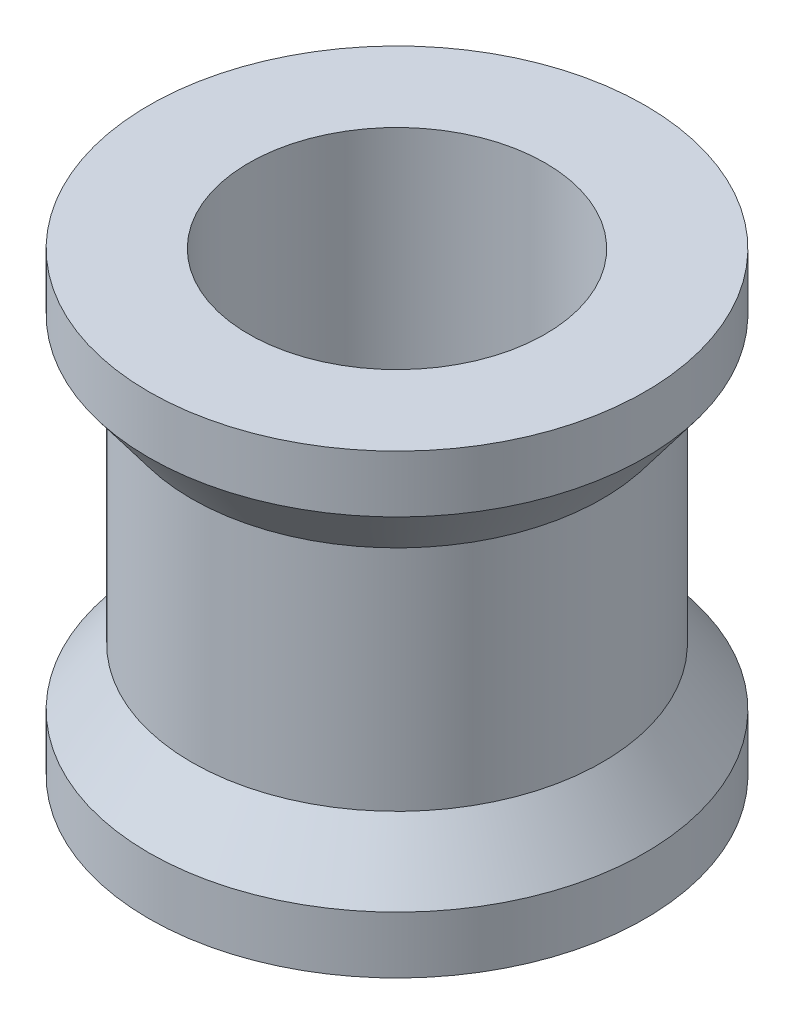
ISO-10303-21;
HEADER;
FILE_DESCRIPTION(('STEP AP214'),'2;1');
FILE_NAME('part.step','',(''),(''),'','','');
FILE_SCHEMA(('AUTOMOTIVE_DESIGN { 1 0 10303 214 1 1 1 1 }'));
ENDSEC;
DATA;
#1=APPLICATION_CONTEXT('core data for automotive mechanical design processes');
#2=APPLICATION_PROTOCOL_DEFINITION('international standard','automotive_design',2000,#1);
#3=PRODUCT_CONTEXT('',#1,'mechanical');
#4=PRODUCT('Part','Part','',(#3));
#5=PRODUCT_RELATED_PRODUCT_CATEGORY('part','',(#4));
#6=PRODUCT_DEFINITION_FORMATION('','',#4);
#7=PRODUCT_DEFINITION_CONTEXT('part definition',#1,'design');
#8=PRODUCT_DEFINITION('design','',#6,#7);
#9=PRODUCT_DEFINITION_SHAPE('','',#8);
#10=(LENGTH_UNIT() NAMED_UNIT(*) SI_UNIT(.MILLI.,.METRE.));
#11=(NAMED_UNIT(*) PLANE_ANGLE_UNIT() SI_UNIT($,.RADIAN.));
#12=(NAMED_UNIT(*) SI_UNIT($,.STERADIAN.) SOLID_ANGLE_UNIT());
#13=UNCERTAINTY_MEASURE_WITH_UNIT(LENGTH_MEASURE(1.E-05),#10,'distance_accuracy_value','');
#14=(GEOMETRIC_REPRESENTATION_CONTEXT(3) GLOBAL_UNCERTAINTY_ASSIGNED_CONTEXT((#13)) GLOBAL_UNIT_ASSIGNED_CONTEXT((#10,
#11,#12)) REPRESENTATION_CONTEXT('',''));
#15=CARTESIAN_POINT('',(0.,0.,0.));
#16=DIRECTION('',(0.,0.,1.));
#17=DIRECTION('',(1.,0.,0.));
#18=AXIS2_PLACEMENT_3D('',#15,#16,#17);
#19=CARTESIAN_POINT('',(-2.6,0.,0.));
#20=DIRECTION('',(0.,1.,0.));
#21=DIRECTION('',(0.,0.,1.));
#22=AXIS2_PLACEMENT_3D('',#19,#20,#21);
#23=PLANE('',#22);
#24=CARTESIAN_POINT('',(0.,0.,0.));
#25=DIRECTION('',(0.,-1.,0.));
#26=DIRECTION('',(0.,0.,-1.));
#27=AXIS2_PLACEMENT_3D('',#24,#25,#26);
#28=CIRCLE('',#27,2.6);
#29=CARTESIAN_POINT('',(0.,0.,-2.6));
#30=VERTEX_POINT('',#29);
#31=EDGE_CURVE('E59',#30,#30,#28,.T.);
#32=ORIENTED_EDGE('',*,*,#31,.F.);
#33=EDGE_LOOP('',(#32));
#34=FACE_BOUND('',#33,.T.);
#35=CARTESIAN_POINT('',(0.,0.,0.));
#36=DIRECTION('',(0.,-1.,0.));
#37=DIRECTION('',(0.,0.,-1.));
#38=AXIS2_PLACEMENT_3D('',#35,#36,#37);
#39=CIRCLE('',#38,4.35);
#40=CARTESIAN_POINT('',(0.,0.,-4.35));
#41=VERTEX_POINT('',#40);
#42=EDGE_CURVE('E10',#41,#41,#39,.T.);
#43=ORIENTED_EDGE('',*,*,#42,.T.);
#44=EDGE_LOOP('',(#43));
#45=FACE_BOUND('',#44,.T.);
#46=ADVANCED_FACE('F31',(#34,#45),#23,.F.);
#47=CARTESIAN_POINT('',(0.,0.,0.));
#48=DIRECTION('',(0.,-1.,0.));
#49=DIRECTION('',(0.,0.,-1.));
#50=AXIS2_PLACEMENT_3D('',#47,#48,#49);
#51=CYLINDRICAL_SURFACE('',#50,4.35);
#52=ORIENTED_EDGE('',*,*,#42,.F.);
#53=EDGE_LOOP('',(#52));
#54=FACE_BOUND('',#53,.T.);
#55=CARTESIAN_POINT('',(0.,1.,0.));
#56=DIRECTION('',(0.,-1.,0.));
#57=DIRECTION('',(0.,0.,-1.));
#58=AXIS2_PLACEMENT_3D('',#55,#56,#57);
#59=CIRCLE('',#58,4.35);
#60=CARTESIAN_POINT('',(0.,1.,-4.35));
#61=VERTEX_POINT('',#60);
#62=EDGE_CURVE('E37',#61,#61,#59,.T.);
#63=ORIENTED_EDGE('',*,*,#62,.T.);
#64=EDGE_LOOP('',(#63));
#65=FACE_BOUND('',#64,.T.);
#66=ADVANCED_FACE('F66',(#54,#65),#51,.T.);
#67=CARTESIAN_POINT('',(0.,2.,0.));
#68=DIRECTION('',(0.,-1.,0.));
#69=DIRECTION('',(0.,0.,-1.));
#70=AXIS2_PLACEMENT_3D('',#67,#68,#69);
#71=CONICAL_SURFACE('',#70,3.6,0.643501108793284);
#72=ORIENTED_EDGE('',*,*,#62,.F.);
#73=EDGE_LOOP('',(#72));
#74=FACE_BOUND('',#73,.T.);
#75=CARTESIAN_POINT('',(0.,2.,0.));
#76=DIRECTION('',(0.,-1.,0.));
#77=DIRECTION('',(0.,0.,-1.));
#78=AXIS2_PLACEMENT_3D('',#75,#76,#77);
#79=CIRCLE('',#78,3.6);
#80=CARTESIAN_POINT('',(0.,2.,-3.6));
#81=VERTEX_POINT('',#80);
#82=EDGE_CURVE('E41',#81,#81,#79,.T.);
#83=ORIENTED_EDGE('',*,*,#82,.T.);
#84=EDGE_LOOP('',(#83));
#85=FACE_BOUND('',#84,.T.);
#86=ADVANCED_FACE('F70',(#74,#85),#71,.T.);
#87=CARTESIAN_POINT('',(0.,0.,0.));
#88=DIRECTION('',(0.,-1.,0.));
#89=DIRECTION('',(0.,0.,-1.));
#90=AXIS2_PLACEMENT_3D('',#87,#88,#89);
#91=CYLINDRICAL_SURFACE('',#90,3.6);
#92=ORIENTED_EDGE('',*,*,#82,.F.);
#93=EDGE_LOOP('',(#92));
#94=FACE_BOUND('',#93,.T.);
#95=CARTESIAN_POINT('',(0.,6.,0.));
#96=DIRECTION('',(0.,-1.,0.));
#97=DIRECTION('',(0.,0.,-1.));
#98=AXIS2_PLACEMENT_3D('',#95,#96,#97);
#99=CIRCLE('',#98,3.6);
#100=CARTESIAN_POINT('',(0.,6.,-3.6));
#101=VERTEX_POINT('',#100);
#102=EDGE_CURVE('E45',#101,#101,#99,.T.);
#103=ORIENTED_EDGE('',*,*,#102,.T.);
#104=EDGE_LOOP('',(#103));
#105=FACE_BOUND('',#104,.T.);
#106=ADVANCED_FACE('F75',(#94,#105),#91,.T.);
#107=CARTESIAN_POINT('',(0.,7.,0.));
#108=DIRECTION('',(0.,1.,0.));
#109=DIRECTION('',(0.,0.,1.));
#110=AXIS2_PLACEMENT_3D('',#107,#108,#109);
#111=CONICAL_SURFACE('',#110,4.35,0.643501108793284);
#112=ORIENTED_EDGE('',*,*,#102,.F.);
#113=EDGE_LOOP('',(#112));
#114=FACE_BOUND('',#113,.T.);
#115=CARTESIAN_POINT('',(0.,7.,0.));
#116=DIRECTION('',(0.,-1.,0.));
#117=DIRECTION('',(0.,0.,-1.));
#118=AXIS2_PLACEMENT_3D('',#115,#116,#117);
#119=CIRCLE('',#118,4.35);
#120=CARTESIAN_POINT('',(0.,7.,-4.35));
#121=VERTEX_POINT('',#120);
#122=EDGE_CURVE('E50',#121,#121,#119,.T.);
#123=ORIENTED_EDGE('',*,*,#122,.T.);
#124=EDGE_LOOP('',(#123));
#125=FACE_BOUND('',#124,.T.);
#126=ADVANCED_FACE('F81',(#114,#125),#111,.T.);
#127=CARTESIAN_POINT('',(0.,0.,0.));
#128=DIRECTION('',(0.,-1.,0.));
#129=DIRECTION('',(0.,0.,-1.));
#130=AXIS2_PLACEMENT_3D('',#127,#128,#129);
#131=CYLINDRICAL_SURFACE('',#130,4.35);
#132=ORIENTED_EDGE('',*,*,#122,.F.);
#133=EDGE_LOOP('',(#132));
#134=FACE_BOUND('',#133,.T.);
#135=CARTESIAN_POINT('',(0.,8.,0.));
#136=DIRECTION('',(0.,-1.,0.));
#137=DIRECTION('',(0.,0.,-1.));
#138=AXIS2_PLACEMENT_3D('',#135,#136,#137);
#139=CIRCLE('',#138,4.35);
#140=CARTESIAN_POINT('',(0.,8.,-4.35));
#141=VERTEX_POINT('',#140);
#142=EDGE_CURVE('E53',#141,#141,#139,.T.);
#143=ORIENTED_EDGE('',*,*,#142,.T.);
#144=EDGE_LOOP('',(#143));
#145=FACE_BOUND('',#144,.T.);
#146=ADVANCED_FACE('F85',(#134,#145),#131,.T.);
#147=CARTESIAN_POINT('',(-2.6,8.,0.));
#148=DIRECTION('',(0.,-1.,0.));
#149=DIRECTION('',(0.,0.,-1.));
#150=AXIS2_PLACEMENT_3D('',#147,#148,#149);
#151=PLANE('',#150);
#152=ORIENTED_EDGE('',*,*,#142,.F.);
#153=EDGE_LOOP('',(#152));
#154=FACE_BOUND('',#153,.T.);
#155=CARTESIAN_POINT('',(0.,8.,0.));
#156=DIRECTION('',(0.,-1.,0.));
#157=DIRECTION('',(0.,0.,-1.));
#158=AXIS2_PLACEMENT_3D('',#155,#156,#157);
#159=CIRCLE('',#158,2.6);
#160=CARTESIAN_POINT('',(0.,8.,-2.6));
#161=VERTEX_POINT('',#160);
#162=EDGE_CURVE('E56',#161,#161,#159,.T.);
#163=ORIENTED_EDGE('',*,*,#162,.T.);
#164=EDGE_LOOP('',(#163));
#165=FACE_BOUND('',#164,.T.);
#166=ADVANCED_FACE('F89',(#154,#165),#151,.F.);
#167=CARTESIAN_POINT('',(0.,0.,0.));
#168=DIRECTION('',(0.,-1.,0.));
#169=DIRECTION('',(0.,0.,-1.));
#170=AXIS2_PLACEMENT_3D('',#167,#168,#169);
#171=CYLINDRICAL_SURFACE('',#170,2.6);
#172=ORIENTED_EDGE('',*,*,#162,.F.);
#173=EDGE_LOOP('',(#172));
#174=FACE_BOUND('',#173,.T.);
#175=ORIENTED_EDGE('',*,*,#31,.T.);
#176=EDGE_LOOP('',(#175));
#177=FACE_BOUND('',#176,.T.);
#178=ADVANCED_FACE('F63',(#174,#177),#171,.F.);
#179=CLOSED_SHELL('',(#46,#66,#86,#106,#126,#146,#166,#178));
#180=MANIFOLD_SOLID_BREP('B2',#179);
#181=ADVANCED_BREP_SHAPE_REPRESENTATION('',(#18,#180),#14);
#182=SHAPE_DEFINITION_REPRESENTATION(#9,#181);
ENDSEC;
END-ISO-10303-21;
